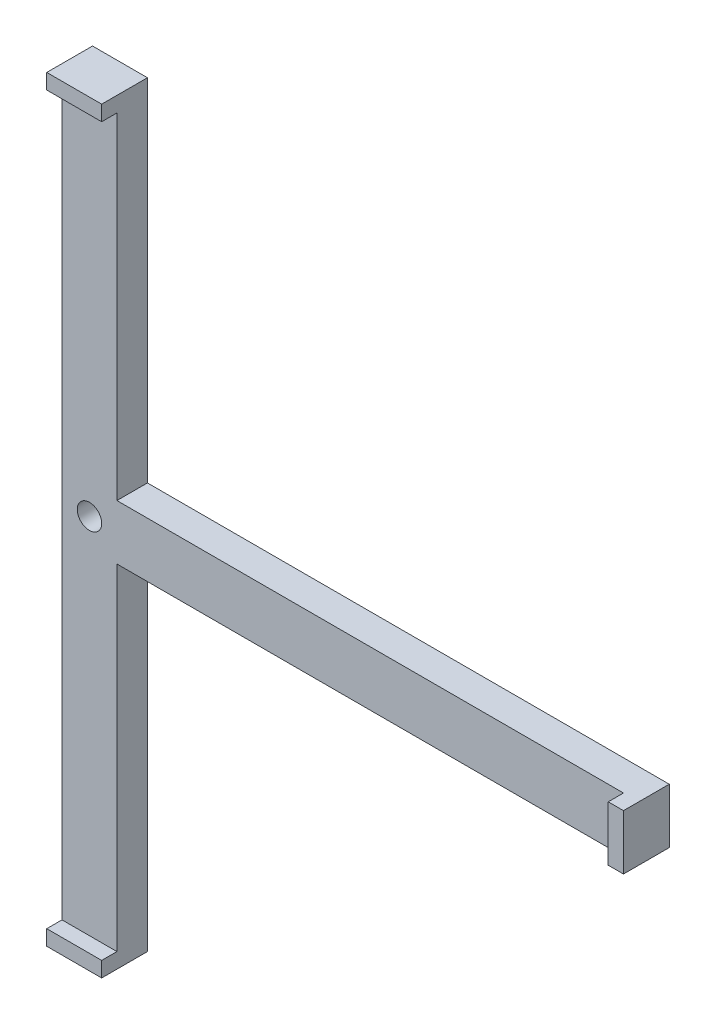
ISO-10303-21;
HEADER;
FILE_DESCRIPTION(('STEP AP214'),'2;1');
FILE_NAME('part.step','',(''),(''),'','','');
FILE_SCHEMA(('AUTOMOTIVE_DESIGN { 1 0 10303 214 1 1 1 1 }'));
ENDSEC;
DATA;
#1=APPLICATION_CONTEXT('core data for automotive mechanical design processes');
#2=APPLICATION_PROTOCOL_DEFINITION('international standard','automotive_design',2000,#1);
#3=PRODUCT_CONTEXT('',#1,'mechanical');
#4=PRODUCT('Part','Part','',(#3));
#5=PRODUCT_RELATED_PRODUCT_CATEGORY('part','',(#4));
#6=PRODUCT_DEFINITION_FORMATION('','',#4);
#7=PRODUCT_DEFINITION_CONTEXT('part definition',#1,'design');
#8=PRODUCT_DEFINITION('design','',#6,#7);
#9=PRODUCT_DEFINITION_SHAPE('','',#8);
#10=(LENGTH_UNIT() NAMED_UNIT(*) SI_UNIT(.MILLI.,.METRE.));
#11=(NAMED_UNIT(*) PLANE_ANGLE_UNIT() SI_UNIT($,.RADIAN.));
#12=(NAMED_UNIT(*) SI_UNIT($,.STERADIAN.) SOLID_ANGLE_UNIT());
#13=UNCERTAINTY_MEASURE_WITH_UNIT(LENGTH_MEASURE(1.E-05),#10,'distance_accuracy_value','');
#14=(GEOMETRIC_REPRESENTATION_CONTEXT(3) GLOBAL_UNCERTAINTY_ASSIGNED_CONTEXT((#13)) GLOBAL_UNIT_ASSIGNED_CONTEXT((#10,
#11,#12)) REPRESENTATION_CONTEXT('',''));
#15=CARTESIAN_POINT('',(0.,0.,0.));
#16=DIRECTION('',(0.,0.,1.));
#17=DIRECTION('',(1.,0.,0.));
#18=AXIS2_PLACEMENT_3D('',#15,#16,#17);
#19=CARTESIAN_POINT('',(0.,0.,10.));
#20=DIRECTION('',(0.,0.,-1.));
#21=DIRECTION('',(-1.,0.,0.));
#22=AXIS2_PLACEMENT_3D('',#19,#20,#21);
#23=PLANE('',#22);
#24=DIRECTION('',(0.,1.,0.));
#25=VECTOR('',#24,1.);
#26=CARTESIAN_POINT('',(11.202614379085,-228.751633986928,10.));
#27=LINE('',#26,#25);
#28=CARTESIAN_POINT('',(11.202614379085,-228.751633986928,10.));
#29=VERTEX_POINT('',#28);
#30=CARTESIAN_POINT('',(11.202614379085,-118.751633986928,10.));
#31=VERTEX_POINT('',#30);
#32=EDGE_CURVE('E135',#29,#31,#27,.T.);
#33=ORIENTED_EDGE('',*,*,#32,.T.);
#34=DIRECTION('',(1.,0.,0.));
#35=VECTOR('',#34,1.);
#36=CARTESIAN_POINT('',(11.202614379085,-118.751633986928,10.));
#37=LINE('',#36,#35);
#38=CARTESIAN_POINT('',(177.202614379085,-118.751633986928,10.));
#39=VERTEX_POINT('',#38);
#40=EDGE_CURVE('E140',#31,#39,#37,.T.);
#41=ORIENTED_EDGE('',*,*,#40,.T.);
#42=DIRECTION('',(0.,1.,0.));
#43=VECTOR('',#42,1.);
#44=CARTESIAN_POINT('',(177.202614379085,-118.751633986928,10.));
#45=LINE('',#44,#43);
#46=CARTESIAN_POINT('',(177.202614379085,-100.751633986928,10.));
#47=VERTEX_POINT('',#46);
#48=EDGE_CURVE('E99',#39,#47,#45,.T.);
#49=ORIENTED_EDGE('',*,*,#48,.T.);
#50=DIRECTION('',(-1.,0.,0.));
#51=VECTOR('',#50,1.);
#52=CARTESIAN_POINT('',(177.202614379085,-100.751633986928,10.));
#53=LINE('',#52,#51);
#54=CARTESIAN_POINT('',(11.202614379085,-100.751633986928,10.));
#55=VERTEX_POINT('',#54);
#56=EDGE_CURVE('E89',#47,#55,#53,.T.);
#57=ORIENTED_EDGE('',*,*,#56,.T.);
#58=DIRECTION('',(0.,1.,0.));
#59=VECTOR('',#58,1.);
#60=CARTESIAN_POINT('',(11.202614379085,-100.751633986928,10.));
#61=LINE('',#60,#59);
#62=CARTESIAN_POINT('',(11.202614379085,9.2483660130719,10.));
#63=VERTEX_POINT('',#62);
#64=EDGE_CURVE('E96',#55,#63,#61,.T.);
#65=ORIENTED_EDGE('',*,*,#64,.T.);
#66=DIRECTION('',(-1.,0.,0.));
#67=VECTOR('',#66,1.);
#68=CARTESIAN_POINT('',(11.202614379085,9.2483660130719,10.));
#69=LINE('',#68,#67);
#70=CARTESIAN_POINT('',(-6.79738562091503,9.2483660130719,10.));
#71=VERTEX_POINT('',#70);
#72=EDGE_CURVE('E116',#63,#71,#69,.T.);
#73=ORIENTED_EDGE('',*,*,#72,.T.);
#74=DIRECTION('',(0.,-1.,0.));
#75=VECTOR('',#74,1.);
#76=CARTESIAN_POINT('',(-6.79738562091503,9.2483660130719,10.));
#77=LINE('',#76,#75);
#78=CARTESIAN_POINT('',(-6.79738562091496,-228.751633986928,10.));
#79=VERTEX_POINT('',#78);
#80=EDGE_CURVE('E118',#71,#79,#77,.T.);
#81=ORIENTED_EDGE('',*,*,#80,.T.);
#82=DIRECTION('',(1.,0.,0.));
#83=VECTOR('',#82,1.);
#84=CARTESIAN_POINT('',(-6.79738562091496,-228.751633986928,10.));
#85=LINE('',#84,#83);
#86=EDGE_CURVE('E71',#79,#29,#85,.T.);
#87=ORIENTED_EDGE('',*,*,#86,.T.);
#88=EDGE_LOOP('',(#33,#41,#49,#57,#65,#73,#81,#87));
#89=FACE_BOUND('',#88,.T.);
#90=CARTESIAN_POINT('',(2.20261437908499,-109.751633986928,10.));
#91=DIRECTION('',(0.,0.,1.));
#92=DIRECTION('',(1.,0.,0.));
#93=AXIS2_PLACEMENT_3D('',#90,#91,#92);
#94=CIRCLE('',#93,4.);
#95=CARTESIAN_POINT('',(6.20261437908499,-109.751633986928,10.));
#96=VERTEX_POINT('',#95);
#97=EDGE_CURVE('E128',#96,#96,#94,.T.);
#98=ORIENTED_EDGE('',*,*,#97,.F.);
#99=EDGE_LOOP('',(#98));
#100=FACE_BOUND('',#99,.T.);
#101=ADVANCED_FACE('F35',(#89,#100),#23,.F.);
#102=CARTESIAN_POINT('',(0.,0.,0.));
#103=DIRECTION('',(0.,0.,-1.));
#104=DIRECTION('',(-1.,0.,0.));
#105=AXIS2_PLACEMENT_3D('',#102,#103,#104);
#106=PLANE('',#105);
#107=DIRECTION('',(0.,1.,0.));
#108=VECTOR('',#107,1.);
#109=CARTESIAN_POINT('',(11.202614379085,-228.751633986928,0.));
#110=LINE('',#109,#108);
#111=CARTESIAN_POINT('',(11.2026143790849,-233.751633986928,0.));
#112=VERTEX_POINT('',#111);
#113=CARTESIAN_POINT('',(11.202614379085,-118.751633986928,0.));
#114=VERTEX_POINT('',#113);
#115=EDGE_CURVE('E125',#112,#114,#110,.T.);
#116=ORIENTED_EDGE('',*,*,#115,.F.);
#117=DIRECTION('',(-1.,0.,0.));
#118=VECTOR('',#117,1.);
#119=CARTESIAN_POINT('',(-6.79738562091503,-233.751633986928,0.));
#120=LINE('',#119,#118);
#121=CARTESIAN_POINT('',(-6.79738562091503,-233.751633986928,0.));
#122=VERTEX_POINT('',#121);
#123=EDGE_CURVE('E160',#112,#122,#120,.T.);
#124=ORIENTED_EDGE('',*,*,#123,.T.);
#125=DIRECTION('',(0.,-1.,0.));
#126=VECTOR('',#125,1.);
#127=CARTESIAN_POINT('',(-6.79738562091503,9.2483660130719,0.));
#128=LINE('',#127,#126);
#129=CARTESIAN_POINT('',(-6.79738562091503,14.2483660130719,0.));
#130=VERTEX_POINT('',#129);
#131=EDGE_CURVE('E133',#130,#122,#128,.T.);
#132=ORIENTED_EDGE('',*,*,#131,.F.);
#133=DIRECTION('',(1.,0.,0.));
#134=VECTOR('',#133,1.);
#135=CARTESIAN_POINT('',(-6.79738562091503,14.2483660130719,0.));
#136=LINE('',#135,#134);
#137=CARTESIAN_POINT('',(11.202614379085,14.2483660130719,0.));
#138=VERTEX_POINT('',#137);
#139=EDGE_CURVE('E206',#130,#138,#136,.T.);
#140=ORIENTED_EDGE('',*,*,#139,.T.);
#141=DIRECTION('',(0.,1.,0.));
#142=VECTOR('',#141,1.);
#143=CARTESIAN_POINT('',(11.202614379085,-100.751633986928,0.));
#144=LINE('',#143,#142);
#145=CARTESIAN_POINT('',(11.202614379085,-100.751633986928,0.));
#146=VERTEX_POINT('',#145);
#147=EDGE_CURVE('E131',#146,#138,#144,.T.);
#148=ORIENTED_EDGE('',*,*,#147,.F.);
#149=DIRECTION('',(-1.,0.,0.));
#150=VECTOR('',#149,1.);
#151=CARTESIAN_POINT('',(177.202614379085,-100.751633986928,0.));
#152=LINE('',#151,#150);
#153=CARTESIAN_POINT('',(182.202614379085,-100.751633986928,0.));
#154=VERTEX_POINT('',#153);
#155=EDGE_CURVE('E107',#154,#146,#152,.T.);
#156=ORIENTED_EDGE('',*,*,#155,.F.);
#157=DIRECTION('',(0.,-1.,0.));
#158=VECTOR('',#157,1.);
#159=CARTESIAN_POINT('',(182.202614379085,-100.751633986928,0.));
#160=LINE('',#159,#158);
#161=CARTESIAN_POINT('',(182.202614379085,-118.751633986928,0.));
#162=VERTEX_POINT('',#161);
#163=EDGE_CURVE('E184',#154,#162,#160,.T.);
#164=ORIENTED_EDGE('',*,*,#163,.T.);
#165=DIRECTION('',(1.,0.,0.));
#166=VECTOR('',#165,1.);
#167=CARTESIAN_POINT('',(11.202614379085,-118.751633986928,0.));
#168=LINE('',#167,#166);
#169=EDGE_CURVE('E65',#114,#162,#168,.T.);
#170=ORIENTED_EDGE('',*,*,#169,.F.);
#171=EDGE_LOOP('',(#116,#124,#132,#140,#148,#156,#164,#170));
#172=FACE_BOUND('',#171,.T.);
#173=CARTESIAN_POINT('',(2.20261437908499,-109.751633986928,0.));
#174=DIRECTION('',(0.,0.,1.));
#175=DIRECTION('',(1.,0.,0.));
#176=AXIS2_PLACEMENT_3D('',#173,#174,#175);
#177=CIRCLE('',#176,4.);
#178=CARTESIAN_POINT('',(6.20261437908499,-109.751633986928,0.));
#179=VERTEX_POINT('',#178);
#180=EDGE_CURVE('E146',#179,#179,#177,.T.);
#181=ORIENTED_EDGE('',*,*,#180,.T.);
#182=EDGE_LOOP('',(#181));
#183=FACE_BOUND('',#182,.T.);
#184=ADVANCED_FACE('F283',(#172,#183),#106,.T.);
#185=CARTESIAN_POINT('',(11.202614379085,-228.751633986928,10.));
#186=DIRECTION('',(-1.,0.,0.));
#187=DIRECTION('',(0.,-1.,0.));
#188=AXIS2_PLACEMENT_3D('',#185,#186,#187);
#189=PLANE('',#188);
#190=ORIENTED_EDGE('',*,*,#115,.T.);
#191=DIRECTION('',(0.,0.,-1.));
#192=VECTOR('',#191,1.);
#193=CARTESIAN_POINT('',(11.202614379085,-118.751633986928,10.));
#194=LINE('',#193,#192);
#195=EDGE_CURVE('E11',#31,#114,#194,.T.);
#196=ORIENTED_EDGE('',*,*,#195,.F.);
#197=ORIENTED_EDGE('',*,*,#32,.F.);
#198=DIRECTION('',(0.,0.,-1.));
#199=VECTOR('',#198,1.);
#200=CARTESIAN_POINT('',(11.202614379085,-228.751633986928,15.));
#201=LINE('',#200,#199);
#202=CARTESIAN_POINT('',(11.202614379085,-228.751633986928,15.));
#203=VERTEX_POINT('',#202);
#204=EDGE_CURVE('E52',#203,#29,#201,.T.);
#205=ORIENTED_EDGE('',*,*,#204,.F.);
#206=DIRECTION('',(0.,-1.,0.));
#207=VECTOR('',#206,1.);
#208=CARTESIAN_POINT('',(11.2026143790849,-233.751633986928,15.));
#209=LINE('',#208,#207);
#210=CARTESIAN_POINT('',(11.2026143790849,-233.751633986928,15.));
#211=VERTEX_POINT('',#210);
#212=EDGE_CURVE('E167',#203,#211,#209,.T.);
#213=ORIENTED_EDGE('',*,*,#212,.T.);
#214=DIRECTION('',(0.,0.,-1.));
#215=VECTOR('',#214,1.);
#216=CARTESIAN_POINT('',(11.2026143790849,-233.751633986928,15.));
#217=LINE('',#216,#215);
#218=EDGE_CURVE('E156',#211,#112,#217,.T.);
#219=ORIENTED_EDGE('',*,*,#218,.T.);
#220=EDGE_LOOP('',(#190,#196,#197,#205,#213,#219));
#221=FACE_BOUND('',#220,.T.);
#222=ADVANCED_FACE('F37',(#221),#189,.F.);
#223=CARTESIAN_POINT('',(11.202614379085,-118.751633986928,10.));
#224=DIRECTION('',(0.,1.,0.));
#225=DIRECTION('',(-1.,0.,0.));
#226=AXIS2_PLACEMENT_3D('',#223,#224,#225);
#227=PLANE('',#226);
#228=ORIENTED_EDGE('',*,*,#169,.T.);
#229=DIRECTION('',(0.,0.,-1.));
#230=VECTOR('',#229,1.);
#231=CARTESIAN_POINT('',(182.202614379085,-118.751633986928,15.));
#232=LINE('',#231,#230);
#233=CARTESIAN_POINT('',(182.202614379085,-118.751633986928,15.));
#234=VERTEX_POINT('',#233);
#235=EDGE_CURVE('E164',#234,#162,#232,.T.);
#236=ORIENTED_EDGE('',*,*,#235,.F.);
#237=DIRECTION('',(-1.,0.,0.));
#238=VECTOR('',#237,1.);
#239=CARTESIAN_POINT('',(182.202614379085,-118.751633986928,15.));
#240=LINE('',#239,#238);
#241=CARTESIAN_POINT('',(177.202614379085,-118.751633986928,15.));
#242=VERTEX_POINT('',#241);
#243=EDGE_CURVE('E186',#234,#242,#240,.T.);
#244=ORIENTED_EDGE('',*,*,#243,.T.);
#245=DIRECTION('',(0.,0.,-1.));
#246=VECTOR('',#245,1.);
#247=CARTESIAN_POINT('',(177.202614379085,-118.751633986928,15.));
#248=LINE('',#247,#246);
#249=EDGE_CURVE('E174',#242,#39,#248,.T.);
#250=ORIENTED_EDGE('',*,*,#249,.T.);
#251=ORIENTED_EDGE('',*,*,#40,.F.);
#252=ORIENTED_EDGE('',*,*,#195,.T.);
#253=EDGE_LOOP('',(#228,#236,#244,#250,#251,#252));
#254=FACE_BOUND('',#253,.T.);
#255=ADVANCED_FACE('F309',(#254),#227,.F.);
#256=CARTESIAN_POINT('',(177.202614379085,-100.751633986928,10.));
#257=DIRECTION('',(0.,-1.,0.));
#258=DIRECTION('',(1.,0.,0.));
#259=AXIS2_PLACEMENT_3D('',#256,#257,#258);
#260=PLANE('',#259);
#261=ORIENTED_EDGE('',*,*,#155,.T.);
#262=DIRECTION('',(0.,0.,-1.));
#263=VECTOR('',#262,1.);
#264=CARTESIAN_POINT('',(11.202614379085,-100.751633986928,10.));
#265=LINE('',#264,#263);
#266=EDGE_CURVE('E44',#55,#146,#265,.T.);
#267=ORIENTED_EDGE('',*,*,#266,.F.);
#268=ORIENTED_EDGE('',*,*,#56,.F.);
#269=DIRECTION('',(0.,0.,-1.));
#270=VECTOR('',#269,1.);
#271=CARTESIAN_POINT('',(177.202614379085,-100.751633986928,15.));
#272=LINE('',#271,#270);
#273=CARTESIAN_POINT('',(177.202614379085,-100.751633986928,15.));
#274=VERTEX_POINT('',#273);
#275=EDGE_CURVE('E177',#274,#47,#272,.T.);
#276=ORIENTED_EDGE('',*,*,#275,.F.);
#277=DIRECTION('',(1.,0.,0.));
#278=VECTOR('',#277,1.);
#279=CARTESIAN_POINT('',(177.202614379085,-100.751633986928,15.));
#280=LINE('',#279,#278);
#281=CARTESIAN_POINT('',(182.202614379085,-100.751633986928,15.));
#282=VERTEX_POINT('',#281);
#283=EDGE_CURVE('E190',#274,#282,#280,.T.);
#284=ORIENTED_EDGE('',*,*,#283,.T.);
#285=DIRECTION('',(0.,0.,-1.));
#286=VECTOR('',#285,1.);
#287=CARTESIAN_POINT('',(182.202614379085,-100.751633986928,15.));
#288=LINE('',#287,#286);
#289=EDGE_CURVE('E180',#282,#154,#288,.T.);
#290=ORIENTED_EDGE('',*,*,#289,.T.);
#291=EDGE_LOOP('',(#261,#267,#268,#276,#284,#290));
#292=FACE_BOUND('',#291,.T.);
#293=ADVANCED_FACE('F104',(#292),#260,.F.);
#294=CARTESIAN_POINT('',(11.202614379085,-100.751633986928,10.));
#295=DIRECTION('',(-1.,0.,0.));
#296=DIRECTION('',(0.,-1.,0.));
#297=AXIS2_PLACEMENT_3D('',#294,#295,#296);
#298=PLANE('',#297);
#299=ORIENTED_EDGE('',*,*,#147,.T.);
#300=DIRECTION('',(0.,0.,-1.));
#301=VECTOR('',#300,1.);
#302=CARTESIAN_POINT('',(11.202614379085,14.2483660130719,15.));
#303=LINE('',#302,#301);
#304=CARTESIAN_POINT('',(11.202614379085,14.2483660130719,15.));
#305=VERTEX_POINT('',#304);
#306=EDGE_CURVE('E187',#305,#138,#303,.T.);
#307=ORIENTED_EDGE('',*,*,#306,.F.);
#308=DIRECTION('',(0.,-1.,0.));
#309=VECTOR('',#308,1.);
#310=CARTESIAN_POINT('',(11.202614379085,14.2483660130719,15.));
#311=LINE('',#310,#309);
#312=CARTESIAN_POINT('',(11.202614379085,9.2483660130719,15.));
#313=VERTEX_POINT('',#312);
#314=EDGE_CURVE('E209',#305,#313,#311,.T.);
#315=ORIENTED_EDGE('',*,*,#314,.T.);
#316=DIRECTION('',(0.,0.,-1.));
#317=VECTOR('',#316,1.);
#318=CARTESIAN_POINT('',(11.202614379085,9.2483660130719,15.));
#319=LINE('',#318,#317);
#320=EDGE_CURVE('E115',#313,#63,#319,.T.);
#321=ORIENTED_EDGE('',*,*,#320,.T.);
#322=ORIENTED_EDGE('',*,*,#64,.F.);
#323=ORIENTED_EDGE('',*,*,#266,.T.);
#324=EDGE_LOOP('',(#299,#307,#315,#321,#322,#323));
#325=FACE_BOUND('',#324,.T.);
#326=ADVANCED_FACE('F112',(#325),#298,.F.);
#327=CARTESIAN_POINT('',(-6.79738562091503,9.2483660130719,10.));
#328=DIRECTION('',(1.,0.,0.));
#329=DIRECTION('',(0.,1.,0.));
#330=AXIS2_PLACEMENT_3D('',#327,#328,#329);
#331=PLANE('',#330);
#332=ORIENTED_EDGE('',*,*,#131,.T.);
#333=DIRECTION('',(0.,0.,-1.));
#334=VECTOR('',#333,1.);
#335=CARTESIAN_POINT('',(-6.79738562091503,-233.751633986928,15.));
#336=LINE('',#335,#334);
#337=CARTESIAN_POINT('',(-6.79738562091503,-233.751633986928,15.));
#338=VERTEX_POINT('',#337);
#339=EDGE_CURVE('E149',#338,#122,#336,.T.);
#340=ORIENTED_EDGE('',*,*,#339,.F.);
#341=DIRECTION('',(0.,1.,0.));
#342=VECTOR('',#341,1.);
#343=CARTESIAN_POINT('',(-6.79738562091496,-228.751633986928,15.));
#344=LINE('',#343,#342);
#345=CARTESIAN_POINT('',(-6.79738562091496,-228.751633986928,15.));
#346=VERTEX_POINT('',#345);
#347=EDGE_CURVE('E163',#338,#346,#344,.T.);
#348=ORIENTED_EDGE('',*,*,#347,.T.);
#349=DIRECTION('',(0.,0.,-1.));
#350=VECTOR('',#349,1.);
#351=CARTESIAN_POINT('',(-6.79738562091496,-228.751633986928,15.));
#352=LINE('',#351,#350);
#353=EDGE_CURVE('E152',#346,#79,#352,.T.);
#354=ORIENTED_EDGE('',*,*,#353,.T.);
#355=ORIENTED_EDGE('',*,*,#80,.F.);
#356=DIRECTION('',(0.,0.,-1.));
#357=VECTOR('',#356,1.);
#358=CARTESIAN_POINT('',(-6.79738562091503,9.2483660130719,15.));
#359=LINE('',#358,#357);
#360=CARTESIAN_POINT('',(-6.79738562091503,9.2483660130719,15.));
#361=VERTEX_POINT('',#360);
#362=EDGE_CURVE('E199',#361,#71,#359,.T.);
#363=ORIENTED_EDGE('',*,*,#362,.F.);
#364=DIRECTION('',(0.,1.,0.));
#365=VECTOR('',#364,1.);
#366=CARTESIAN_POINT('',(-6.79738562091503,9.2483660130719,15.));
#367=LINE('',#366,#365);
#368=CARTESIAN_POINT('',(-6.79738562091503,14.2483660130719,15.));
#369=VERTEX_POINT('',#368);
#370=EDGE_CURVE('E212',#361,#369,#367,.T.);
#371=ORIENTED_EDGE('',*,*,#370,.T.);
#372=DIRECTION('',(0.,0.,-1.));
#373=VECTOR('',#372,1.);
#374=CARTESIAN_POINT('',(-6.79738562091503,14.2483660130719,15.));
#375=LINE('',#374,#373);
#376=EDGE_CURVE('E202',#369,#130,#375,.T.);
#377=ORIENTED_EDGE('',*,*,#376,.T.);
#378=EDGE_LOOP('',(#332,#340,#348,#354,#355,#363,#371,#377));
#379=FACE_BOUND('',#378,.T.);
#380=ADVANCED_FACE('F239',(#379),#331,.F.);
#381=CARTESIAN_POINT('',(2.20261437908499,-109.751633986928,10.));
#382=DIRECTION('',(0.,0.,-1.));
#383=DIRECTION('',(-1.,0.,0.));
#384=AXIS2_PLACEMENT_3D('',#381,#382,#383);
#385=CYLINDRICAL_SURFACE('',#384,4.);
#386=ORIENTED_EDGE('',*,*,#97,.T.);
#387=EDGE_LOOP('',(#386));
#388=FACE_BOUND('',#387,.T.);
#389=ORIENTED_EDGE('',*,*,#180,.F.);
#390=EDGE_LOOP('',(#389));
#391=FACE_BOUND('',#390,.T.);
#392=ADVANCED_FACE('F294',(#388,#391),#385,.F.);
#393=CARTESIAN_POINT('',(-6.79738562091496,-228.751633986928,15.));
#394=DIRECTION('',(0.,1.,0.));
#395=DIRECTION('',(0.,0.,1.));
#396=AXIS2_PLACEMENT_3D('',#393,#394,#395);
#397=PLANE('',#396);
#398=ORIENTED_EDGE('',*,*,#86,.F.);
#399=ORIENTED_EDGE('',*,*,#353,.F.);
#400=DIRECTION('',(1.,0.,0.));
#401=VECTOR('',#400,1.);
#402=CARTESIAN_POINT('',(-6.79738562091496,-228.751633986928,15.));
#403=LINE('',#402,#401);
#404=EDGE_CURVE('E170',#346,#203,#403,.T.);
#405=ORIENTED_EDGE('',*,*,#404,.T.);
#406=ORIENTED_EDGE('',*,*,#204,.T.);
#407=EDGE_LOOP('',(#398,#399,#405,#406));
#408=FACE_BOUND('',#407,.T.);
#409=ADVANCED_FACE('F250',(#408),#397,.T.);
#410=CARTESIAN_POINT('',(-6.79738562091503,-233.751633986928,15.));
#411=DIRECTION('',(0.,-1.,0.));
#412=DIRECTION('',(0.,0.,-1.));
#413=AXIS2_PLACEMENT_3D('',#410,#411,#412);
#414=PLANE('',#413);
#415=ORIENTED_EDGE('',*,*,#123,.F.);
#416=ORIENTED_EDGE('',*,*,#218,.F.);
#417=DIRECTION('',(-1.,0.,0.));
#418=VECTOR('',#417,1.);
#419=CARTESIAN_POINT('',(-6.79738562091503,-233.751633986928,15.));
#420=LINE('',#419,#418);
#421=EDGE_CURVE('E154',#211,#338,#420,.T.);
#422=ORIENTED_EDGE('',*,*,#421,.T.);
#423=ORIENTED_EDGE('',*,*,#339,.T.);
#424=EDGE_LOOP('',(#415,#416,#422,#423));
#425=FACE_BOUND('',#424,.T.);
#426=ADVANCED_FACE('F285',(#425),#414,.T.);
#427=CARTESIAN_POINT('',(0.,0.,15.));
#428=DIRECTION('',(0.,0.,1.));
#429=DIRECTION('',(1.,0.,0.));
#430=AXIS2_PLACEMENT_3D('',#427,#428,#429);
#431=PLANE('',#430);
#432=ORIENTED_EDGE('',*,*,#347,.F.);
#433=ORIENTED_EDGE('',*,*,#421,.F.);
#434=ORIENTED_EDGE('',*,*,#212,.F.);
#435=ORIENTED_EDGE('',*,*,#404,.F.);
#436=EDGE_LOOP('',(#432,#433,#434,#435));
#437=FACE_BOUND('',#436,.T.);
#438=ADVANCED_FACE('F255',(#437),#431,.T.);
#439=CARTESIAN_POINT('',(177.202614379085,-118.751633986928,15.));
#440=DIRECTION('',(-1.,0.,0.));
#441=DIRECTION('',(0.,0.,1.));
#442=AXIS2_PLACEMENT_3D('',#439,#440,#441);
#443=PLANE('',#442);
#444=ORIENTED_EDGE('',*,*,#48,.F.);
#445=ORIENTED_EDGE('',*,*,#249,.F.);
#446=DIRECTION('',(0.,1.,0.));
#447=VECTOR('',#446,1.);
#448=CARTESIAN_POINT('',(177.202614379085,-118.751633986928,15.));
#449=LINE('',#448,#447);
#450=EDGE_CURVE('E193',#242,#274,#449,.T.);
#451=ORIENTED_EDGE('',*,*,#450,.T.);
#452=ORIENTED_EDGE('',*,*,#275,.T.);
#453=EDGE_LOOP('',(#444,#445,#451,#452));
#454=FACE_BOUND('',#453,.T.);
#455=ADVANCED_FACE('F292',(#454),#443,.T.);
#456=CARTESIAN_POINT('',(182.202614379085,-100.751633986928,15.));
#457=DIRECTION('',(1.,0.,0.));
#458=DIRECTION('',(0.,0.,-1.));
#459=AXIS2_PLACEMENT_3D('',#456,#457,#458);
#460=PLANE('',#459);
#461=ORIENTED_EDGE('',*,*,#163,.F.);
#462=ORIENTED_EDGE('',*,*,#289,.F.);
#463=DIRECTION('',(0.,-1.,0.));
#464=VECTOR('',#463,1.);
#465=CARTESIAN_POINT('',(182.202614379085,-100.751633986928,15.));
#466=LINE('',#465,#464);
#467=EDGE_CURVE('E178',#282,#234,#466,.T.);
#468=ORIENTED_EDGE('',*,*,#467,.T.);
#469=ORIENTED_EDGE('',*,*,#235,.T.);
#470=EDGE_LOOP('',(#461,#462,#468,#469));
#471=FACE_BOUND('',#470,.T.);
#472=ADVANCED_FACE('F318',(#471),#460,.T.);
#473=CARTESIAN_POINT('',(0.,0.,15.));
#474=DIRECTION('',(0.,0.,-1.));
#475=DIRECTION('',(-1.,0.,0.));
#476=AXIS2_PLACEMENT_3D('',#473,#474,#475);
#477=PLANE('',#476);
#478=ORIENTED_EDGE('',*,*,#243,.F.);
#479=ORIENTED_EDGE('',*,*,#467,.F.);
#480=ORIENTED_EDGE('',*,*,#283,.F.);
#481=ORIENTED_EDGE('',*,*,#450,.F.);
#482=EDGE_LOOP('',(#478,#479,#480,#481));
#483=FACE_BOUND('',#482,.T.);
#484=ADVANCED_FACE('F323',(#483),#477,.F.);
#485=CARTESIAN_POINT('',(11.202614379085,9.2483660130719,15.));
#486=DIRECTION('',(0.,-1.,0.));
#487=DIRECTION('',(0.,0.,-1.));
#488=AXIS2_PLACEMENT_3D('',#485,#486,#487);
#489=PLANE('',#488);
#490=ORIENTED_EDGE('',*,*,#72,.F.);
#491=ORIENTED_EDGE('',*,*,#320,.F.);
#492=DIRECTION('',(-1.,0.,0.));
#493=VECTOR('',#492,1.);
#494=CARTESIAN_POINT('',(11.202614379085,9.2483660130719,15.));
#495=LINE('',#494,#493);
#496=EDGE_CURVE('E215',#313,#361,#495,.T.);
#497=ORIENTED_EDGE('',*,*,#496,.T.);
#498=ORIENTED_EDGE('',*,*,#362,.T.);
#499=EDGE_LOOP('',(#490,#491,#497,#498));
#500=FACE_BOUND('',#499,.T.);
#501=ADVANCED_FACE('F244',(#500),#489,.T.);
#502=CARTESIAN_POINT('',(-6.79738562091503,14.2483660130719,15.));
#503=DIRECTION('',(0.,1.,0.));
#504=DIRECTION('',(-1.,0.,0.));
#505=AXIS2_PLACEMENT_3D('',#502,#503,#504);
#506=PLANE('',#505);
#507=ORIENTED_EDGE('',*,*,#139,.F.);
#508=ORIENTED_EDGE('',*,*,#376,.F.);
#509=DIRECTION('',(1.,0.,0.));
#510=VECTOR('',#509,1.);
#511=CARTESIAN_POINT('',(-6.79738562091503,14.2483660130719,15.));
#512=LINE('',#511,#510);
#513=EDGE_CURVE('E200',#369,#305,#512,.T.);
#514=ORIENTED_EDGE('',*,*,#513,.T.);
#515=ORIENTED_EDGE('',*,*,#306,.T.);
#516=EDGE_LOOP('',(#507,#508,#514,#515));
#517=FACE_BOUND('',#516,.T.);
#518=ADVANCED_FACE('F235',(#517),#506,.T.);
#519=CARTESIAN_POINT('',(0.,0.,15.));
#520=DIRECTION('',(0.,0.,-1.));
#521=DIRECTION('',(-1.,0.,0.));
#522=AXIS2_PLACEMENT_3D('',#519,#520,#521);
#523=PLANE('',#522);
#524=ORIENTED_EDGE('',*,*,#314,.F.);
#525=ORIENTED_EDGE('',*,*,#513,.F.);
#526=ORIENTED_EDGE('',*,*,#370,.F.);
#527=ORIENTED_EDGE('',*,*,#496,.F.);
#528=EDGE_LOOP('',(#524,#525,#526,#527));
#529=FACE_BOUND('',#528,.T.);
#530=ADVANCED_FACE('F228',(#529),#523,.F.);
#531=CLOSED_SHELL('',(#101,#184,#222,#255,#293,#326,#380,#392,#409,#426,#438,#455,#472,#484,
#501,#518,#530));
#532=MANIFOLD_SOLID_BREP('B2',#531);
#533=ADVANCED_BREP_SHAPE_REPRESENTATION('',(#18,#532),#14);
#534=SHAPE_DEFINITION_REPRESENTATION(#9,#533);
ENDSEC;
END-ISO-10303-21;
